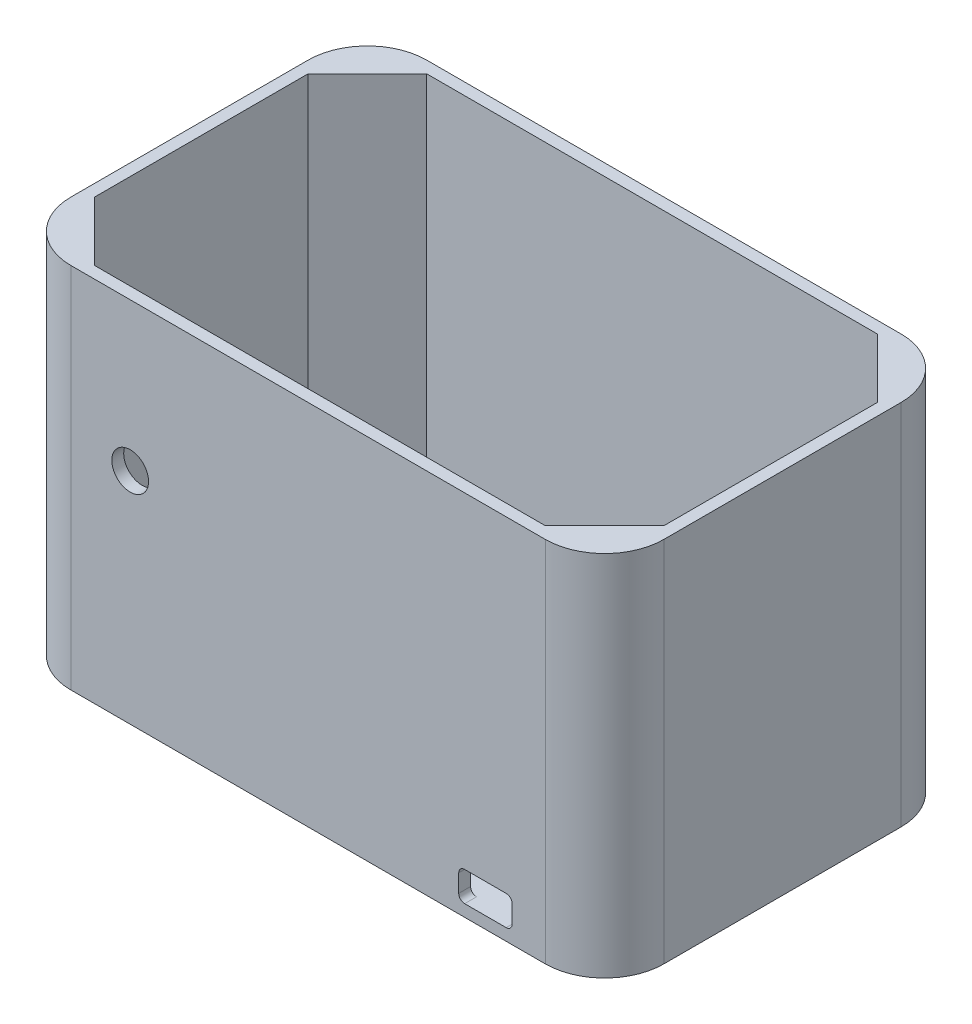
ISO-10303-21;
HEADER;
FILE_DESCRIPTION(('STEP AP214'),'2;1');
FILE_NAME('part.step','',(''),(''),'','','');
FILE_SCHEMA(('AUTOMOTIVE_DESIGN { 1 0 10303 214 1 1 1 1 }'));
ENDSEC;
DATA;
#1=APPLICATION_CONTEXT('core data for automotive mechanical design processes');
#2=APPLICATION_PROTOCOL_DEFINITION('international standard','automotive_design',2000,#1);
#3=PRODUCT_CONTEXT('',#1,'mechanical');
#4=PRODUCT('Part','Part','',(#3));
#5=PRODUCT_RELATED_PRODUCT_CATEGORY('part','',(#4));
#6=PRODUCT_DEFINITION_FORMATION('','',#4);
#7=PRODUCT_DEFINITION_CONTEXT('part definition',#1,'design');
#8=PRODUCT_DEFINITION('design','',#6,#7);
#9=PRODUCT_DEFINITION_SHAPE('','',#8);
#10=(LENGTH_UNIT() NAMED_UNIT(*) SI_UNIT(.MILLI.,.METRE.));
#11=(NAMED_UNIT(*) PLANE_ANGLE_UNIT() SI_UNIT($,.RADIAN.));
#12=(NAMED_UNIT(*) SI_UNIT($,.STERADIAN.) SOLID_ANGLE_UNIT());
#13=UNCERTAINTY_MEASURE_WITH_UNIT(LENGTH_MEASURE(1.E-05),#10,'distance_accuracy_value','');
#14=(GEOMETRIC_REPRESENTATION_CONTEXT(3) GLOBAL_UNCERTAINTY_ASSIGNED_CONTEXT((#13)) GLOBAL_UNIT_ASSIGNED_CONTEXT((#10,
#11,#12)) REPRESENTATION_CONTEXT('',''));
#15=CARTESIAN_POINT('',(0.,0.,0.));
#16=DIRECTION('',(0.,0.,1.));
#17=DIRECTION('',(1.,0.,0.));
#18=AXIS2_PLACEMENT_3D('',#15,#16,#17);
#19=CARTESIAN_POINT('',(90.,2.,-50.));
#20=DIRECTION('',(0.,-1.,0.));
#21=DIRECTION('',(0.,0.,-1.));
#22=AXIS2_PLACEMENT_3D('',#19,#20,#21);
#23=CYLINDRICAL_SURFACE('',#22,9.99999999999999);
#24=CARTESIAN_POINT('',(90.,0.,-50.));
#25=DIRECTION('',(0.,1.,0.));
#26=DIRECTION('',(0.,0.,-1.));
#27=AXIS2_PLACEMENT_3D('',#24,#25,#26);
#28=CIRCLE('',#27,9.99999999999999);
#29=CARTESIAN_POINT('',(100.,0.,-49.9999999999999));
#30=VERTEX_POINT('',#29);
#31=CARTESIAN_POINT('',(89.9999999999999,0.,-60.));
#32=VERTEX_POINT('',#31);
#33=EDGE_CURVE('E393',#30,#32,#28,.T.);
#34=ORIENTED_EDGE('',*,*,#33,.T.);
#35=DIRECTION('',(0.,-1.,0.));
#36=VECTOR('',#35,1.);
#37=CARTESIAN_POINT('',(89.9999999999999,2.,-60.));
#38=LINE('',#37,#36);
#39=CARTESIAN_POINT('',(89.9999999999999,62.,-60.));
#40=VERTEX_POINT('',#39);
#41=EDGE_CURVE('E446',#40,#32,#38,.T.);
#42=ORIENTED_EDGE('',*,*,#41,.F.);
#43=CARTESIAN_POINT('',(90.,62.,-50.));
#44=DIRECTION('',(0.,1.,0.));
#45=DIRECTION('',(0.,0.,1.));
#46=AXIS2_PLACEMENT_3D('',#43,#44,#45);
#47=CIRCLE('',#46,9.99999999999999);
#48=CARTESIAN_POINT('',(100.,62.,-49.9999999999999));
#49=VERTEX_POINT('',#48);
#50=EDGE_CURVE('E277',#49,#40,#47,.T.);
#51=ORIENTED_EDGE('',*,*,#50,.F.);
#52=DIRECTION('',(0.,-1.,0.));
#53=VECTOR('',#52,1.);
#54=CARTESIAN_POINT('',(100.,2.,-49.9999999999999));
#55=LINE('',#54,#53);
#56=EDGE_CURVE('E418',#49,#30,#55,.T.);
#57=ORIENTED_EDGE('',*,*,#56,.T.);
#58=EDGE_LOOP('',(#34,#42,#51,#57));
#59=FACE_BOUND('',#58,.T.);
#60=ADVANCED_FACE('F41',(#59),#23,.T.);
#61=CARTESIAN_POINT('',(10.0000000000001,2.,-60.));
#62=DIRECTION('',(0.,0.,1.));
#63=DIRECTION('',(1.,0.,0.));
#64=AXIS2_PLACEMENT_3D('',#61,#62,#63);
#65=PLANE('',#64);
#66=DIRECTION('',(-1.,0.,0.));
#67=VECTOR('',#66,1.);
#68=CARTESIAN_POINT('',(10.0000000000001,0.,-60.));
#69=LINE('',#68,#67);
#70=CARTESIAN_POINT('',(10.0000000000001,0.,-60.));
#71=VERTEX_POINT('',#70);
#72=EDGE_CURVE('E397',#32,#71,#69,.T.);
#73=ORIENTED_EDGE('',*,*,#72,.T.);
#74=DIRECTION('',(0.,-1.,0.));
#75=VECTOR('',#74,1.);
#76=CARTESIAN_POINT('',(10.0000000000001,2.,-60.));
#77=LINE('',#76,#75);
#78=CARTESIAN_POINT('',(10.0000000000001,62.,-60.));
#79=VERTEX_POINT('',#78);
#80=EDGE_CURVE('E442',#79,#71,#77,.T.);
#81=ORIENTED_EDGE('',*,*,#80,.F.);
#82=DIRECTION('',(-1.,0.,0.));
#83=VECTOR('',#82,1.);
#84=CARTESIAN_POINT('',(0.,62.,-60.));
#85=LINE('',#84,#83);
#86=EDGE_CURVE('E282',#40,#79,#85,.T.);
#87=ORIENTED_EDGE('',*,*,#86,.F.);
#88=ORIENTED_EDGE('',*,*,#41,.T.);
#89=EDGE_LOOP('',(#73,#81,#87,#88));
#90=FACE_BOUND('',#89,.T.);
#91=ADVANCED_FACE('F501',(#90),#65,.F.);
#92=CARTESIAN_POINT('',(10.,2.,-50.));
#93=DIRECTION('',(0.,-1.,0.));
#94=DIRECTION('',(0.,0.,-1.));
#95=AXIS2_PLACEMENT_3D('',#92,#93,#94);
#96=CYLINDRICAL_SURFACE('',#95,10.);
#97=CARTESIAN_POINT('',(10.,0.,-50.));
#98=DIRECTION('',(0.,1.,0.));
#99=DIRECTION('',(0.,0.,-1.));
#100=AXIS2_PLACEMENT_3D('',#97,#98,#99);
#101=CIRCLE('',#100,10.);
#102=CARTESIAN_POINT('',(0.,0.,-49.9999999999999));
#103=VERTEX_POINT('',#102);
#104=EDGE_CURVE('E400',#71,#103,#101,.T.);
#105=ORIENTED_EDGE('',*,*,#104,.T.);
#106=DIRECTION('',(0.,-1.,0.));
#107=VECTOR('',#106,1.);
#108=CARTESIAN_POINT('',(0.,2.,-49.9999999999999));
#109=LINE('',#108,#107);
#110=CARTESIAN_POINT('',(0.,62.,-49.9999999999999));
#111=VERTEX_POINT('',#110);
#112=EDGE_CURVE('E438',#111,#103,#109,.T.);
#113=ORIENTED_EDGE('',*,*,#112,.F.);
#114=CARTESIAN_POINT('',(10.,62.,-50.));
#115=DIRECTION('',(0.,1.,0.));
#116=DIRECTION('',(0.,0.,1.));
#117=AXIS2_PLACEMENT_3D('',#114,#115,#116);
#118=CIRCLE('',#117,10.);
#119=EDGE_CURVE('E286',#79,#111,#118,.T.);
#120=ORIENTED_EDGE('',*,*,#119,.F.);
#121=ORIENTED_EDGE('',*,*,#80,.T.);
#122=EDGE_LOOP('',(#105,#113,#120,#121));
#123=FACE_BOUND('',#122,.T.);
#124=ADVANCED_FACE('F506',(#123),#96,.T.);
#125=CARTESIAN_POINT('',(0.,2.,-10.0000000000001));
#126=DIRECTION('',(1.,0.,0.));
#127=DIRECTION('',(0.,0.,-1.));
#128=AXIS2_PLACEMENT_3D('',#125,#126,#127);
#129=PLANE('',#128);
#130=DIRECTION('',(0.,0.,1.));
#131=VECTOR('',#130,1.);
#132=CARTESIAN_POINT('',(0.,0.,-10.0000000000001));
#133=LINE('',#132,#131);
#134=CARTESIAN_POINT('',(0.,0.,-10.0000000000001));
#135=VERTEX_POINT('',#134);
#136=EDGE_CURVE('E403',#103,#135,#133,.T.);
#137=ORIENTED_EDGE('',*,*,#136,.T.);
#138=DIRECTION('',(0.,-1.,0.));
#139=VECTOR('',#138,1.);
#140=CARTESIAN_POINT('',(0.,2.,-10.0000000000001));
#141=LINE('',#140,#139);
#142=CARTESIAN_POINT('',(0.,62.,-10.0000000000001));
#143=VERTEX_POINT('',#142);
#144=EDGE_CURVE('E434',#143,#135,#141,.T.);
#145=ORIENTED_EDGE('',*,*,#144,.F.);
#146=DIRECTION('',(0.,0.,1.));
#147=VECTOR('',#146,1.);
#148=CARTESIAN_POINT('',(0.,62.,0.));
#149=LINE('',#148,#147);
#150=EDGE_CURVE('E290',#111,#143,#149,.T.);
#151=ORIENTED_EDGE('',*,*,#150,.F.);
#152=ORIENTED_EDGE('',*,*,#112,.T.);
#153=EDGE_LOOP('',(#137,#145,#151,#152));
#154=FACE_BOUND('',#153,.T.);
#155=ADVANCED_FACE('F497',(#154),#129,.F.);
#156=CARTESIAN_POINT('',(10.,2.,-10.));
#157=DIRECTION('',(0.,-1.,0.));
#158=DIRECTION('',(0.,0.,-1.));
#159=AXIS2_PLACEMENT_3D('',#156,#157,#158);
#160=CYLINDRICAL_SURFACE('',#159,10.);
#161=CARTESIAN_POINT('',(10.,0.,-10.));
#162=DIRECTION('',(0.,1.,0.));
#163=DIRECTION('',(0.,0.,-1.));
#164=AXIS2_PLACEMENT_3D('',#161,#162,#163);
#165=CIRCLE('',#164,10.);
#166=CARTESIAN_POINT('',(10.0000000000001,0.,0.));
#167=VERTEX_POINT('',#166);
#168=EDGE_CURVE('E406',#135,#167,#165,.T.);
#169=ORIENTED_EDGE('',*,*,#168,.T.);
#170=DIRECTION('',(0.,-1.,0.));
#171=VECTOR('',#170,1.);
#172=CARTESIAN_POINT('',(10.0000000000001,2.,0.));
#173=LINE('',#172,#171);
#174=CARTESIAN_POINT('',(10.0000000000001,62.,0.));
#175=VERTEX_POINT('',#174);
#176=EDGE_CURVE('E430',#175,#167,#173,.T.);
#177=ORIENTED_EDGE('',*,*,#176,.F.);
#178=CARTESIAN_POINT('',(10.,62.,-10.));
#179=DIRECTION('',(0.,1.,0.));
#180=DIRECTION('',(0.,0.,1.));
#181=AXIS2_PLACEMENT_3D('',#178,#179,#180);
#182=CIRCLE('',#181,10.);
#183=EDGE_CURVE('E294',#143,#175,#182,.T.);
#184=ORIENTED_EDGE('',*,*,#183,.F.);
#185=ORIENTED_EDGE('',*,*,#144,.T.);
#186=EDGE_LOOP('',(#169,#177,#184,#185));
#187=FACE_BOUND('',#186,.T.);
#188=ADVANCED_FACE('F488',(#187),#160,.T.);
#189=CARTESIAN_POINT('',(10.0000000000001,2.,0.));
#190=DIRECTION('',(0.,0.,-1.));
#191=DIRECTION('',(-1.,0.,0.));
#192=AXIS2_PLACEMENT_3D('',#189,#190,#191);
#193=PLANE('',#192);
#194=CARTESIAN_POINT('',(20.0000000000001,37.,0.));
#195=DIRECTION('',(0.,0.,1.));
#196=DIRECTION('',(1.,0.,0.));
#197=AXIS2_PLACEMENT_3D('',#194,#195,#196);
#198=CIRCLE('',#197,3.1);
#199=CARTESIAN_POINT('',(23.1000000000001,37.,0.));
#200=VERTEX_POINT('',#199);
#201=EDGE_CURVE('E250',#200,#200,#198,.T.);
#202=ORIENTED_EDGE('',*,*,#201,.F.);
#203=EDGE_LOOP('',(#202));
#204=FACE_BOUND('',#203,.T.);
#205=DIRECTION('',(-1.,0.,0.));
#206=VECTOR('',#205,1.);
#207=CARTESIAN_POINT('',(76.4,7.,0.));
#208=LINE('',#207,#206);
#209=CARTESIAN_POINT('',(83.4,7.,0.));
#210=VERTEX_POINT('',#209);
#211=CARTESIAN_POINT('',(76.4,7.,0.));
#212=VERTEX_POINT('',#211);
#213=EDGE_CURVE('E215',#210,#212,#208,.T.);
#214=ORIENTED_EDGE('',*,*,#213,.F.);
#215=CARTESIAN_POINT('',(83.4,6.,0.));
#216=DIRECTION('',(0.,0.,1.));
#217=DIRECTION('',(-1.,0.,0.));
#218=AXIS2_PLACEMENT_3D('',#215,#216,#217);
#219=CIRCLE('',#218,1.);
#220=CARTESIAN_POINT('',(84.4,6.,0.));
#221=VERTEX_POINT('',#220);
#222=EDGE_CURVE('E57',#221,#210,#219,.T.);
#223=ORIENTED_EDGE('',*,*,#222,.F.);
#224=DIRECTION('',(0.,1.,0.));
#225=VECTOR('',#224,1.);
#226=CARTESIAN_POINT('',(84.4,3.,0.));
#227=LINE('',#226,#225);
#228=CARTESIAN_POINT('',(84.4,3.,0.));
#229=VERTEX_POINT('',#228);
#230=EDGE_CURVE('E243',#229,#221,#227,.T.);
#231=ORIENTED_EDGE('',*,*,#230,.F.);
#232=CARTESIAN_POINT('',(83.4,3.,0.));
#233=DIRECTION('',(0.,0.,1.));
#234=DIRECTION('',(1.,0.,0.));
#235=AXIS2_PLACEMENT_3D('',#232,#233,#234);
#236=CIRCLE('',#235,1.);
#237=CARTESIAN_POINT('',(83.4,2.,0.));
#238=VERTEX_POINT('',#237);
#239=EDGE_CURVE('E239',#238,#229,#236,.T.);
#240=ORIENTED_EDGE('',*,*,#239,.F.);
#241=DIRECTION('',(1.,0.,0.));
#242=VECTOR('',#241,1.);
#243=CARTESIAN_POINT('',(76.4,2.,0.));
#244=LINE('',#243,#242);
#245=CARTESIAN_POINT('',(76.4,2.,0.));
#246=VERTEX_POINT('',#245);
#247=EDGE_CURVE('E235',#246,#238,#244,.T.);
#248=ORIENTED_EDGE('',*,*,#247,.F.);
#249=CARTESIAN_POINT('',(76.4,3.,0.));
#250=DIRECTION('',(0.,0.,1.));
#251=DIRECTION('',(-1.,0.,0.));
#252=AXIS2_PLACEMENT_3D('',#249,#250,#251);
#253=CIRCLE('',#252,1.);
#254=CARTESIAN_POINT('',(75.4,3.,0.));
#255=VERTEX_POINT('',#254);
#256=EDGE_CURVE('E228',#255,#246,#253,.T.);
#257=ORIENTED_EDGE('',*,*,#256,.F.);
#258=DIRECTION('',(0.,-1.,0.));
#259=VECTOR('',#258,1.);
#260=CARTESIAN_POINT('',(75.4,3.,0.));
#261=LINE('',#260,#259);
#262=CARTESIAN_POINT('',(75.4,6.,0.));
#263=VERTEX_POINT('',#262);
#264=EDGE_CURVE('E224',#263,#255,#261,.T.);
#265=ORIENTED_EDGE('',*,*,#264,.F.);
#266=CARTESIAN_POINT('',(76.4,6.,0.));
#267=DIRECTION('',(0.,0.,1.));
#268=DIRECTION('',(-1.,0.,0.));
#269=AXIS2_PLACEMENT_3D('',#266,#267,#268);
#270=CIRCLE('',#269,1.);
#271=EDGE_CURVE('E205',#212,#263,#270,.T.);
#272=ORIENTED_EDGE('',*,*,#271,.F.);
#273=EDGE_LOOP('',(#214,#223,#231,#240,#248,#257,#265,#272));
#274=FACE_BOUND('',#273,.T.);
#275=DIRECTION('',(1.,0.,0.));
#276=VECTOR('',#275,1.);
#277=CARTESIAN_POINT('',(10.0000000000001,0.,0.));
#278=LINE('',#277,#276);
#279=CARTESIAN_POINT('',(89.9999999999999,0.,0.));
#280=VERTEX_POINT('',#279);
#281=EDGE_CURVE('E409',#167,#280,#278,.T.);
#282=ORIENTED_EDGE('',*,*,#281,.T.);
#283=DIRECTION('',(0.,-1.,0.));
#284=VECTOR('',#283,1.);
#285=CARTESIAN_POINT('',(89.9999999999999,2.,0.));
#286=LINE('',#285,#284);
#287=CARTESIAN_POINT('',(90.,62.,0.));
#288=VERTEX_POINT('',#287);
#289=EDGE_CURVE('E426',#288,#280,#286,.T.);
#290=ORIENTED_EDGE('',*,*,#289,.F.);
#291=DIRECTION('',(1.,0.,0.));
#292=VECTOR('',#291,1.);
#293=CARTESIAN_POINT('',(0.,62.,0.));
#294=LINE('',#293,#292);
#295=EDGE_CURVE('E298',#175,#288,#294,.T.);
#296=ORIENTED_EDGE('',*,*,#295,.F.);
#297=ORIENTED_EDGE('',*,*,#176,.T.);
#298=EDGE_LOOP('',(#282,#290,#296,#297));
#299=FACE_BOUND('',#298,.T.);
#300=ADVANCED_FACE('F220',(#204,#274,#299),#193,.F.);
#301=CARTESIAN_POINT('',(90.,2.,-10.));
#302=DIRECTION('',(0.,-1.,0.));
#303=DIRECTION('',(0.,0.,-1.));
#304=AXIS2_PLACEMENT_3D('',#301,#302,#303);
#305=CYLINDRICAL_SURFACE('',#304,10.);
#306=CARTESIAN_POINT('',(90.,0.,-10.));
#307=DIRECTION('',(0.,1.,0.));
#308=DIRECTION('',(0.,0.,-1.));
#309=AXIS2_PLACEMENT_3D('',#306,#307,#308);
#310=CIRCLE('',#309,10.);
#311=CARTESIAN_POINT('',(100.,0.,-10.0000000000001));
#312=VERTEX_POINT('',#311);
#313=EDGE_CURVE('E412',#280,#312,#310,.T.);
#314=ORIENTED_EDGE('',*,*,#313,.T.);
#315=DIRECTION('',(0.,-1.,0.));
#316=VECTOR('',#315,1.);
#317=CARTESIAN_POINT('',(100.,2.,-10.0000000000001));
#318=LINE('',#317,#316);
#319=CARTESIAN_POINT('',(100.,62.,-10.0000000000001));
#320=VERTEX_POINT('',#319);
#321=EDGE_CURVE('E422',#320,#312,#318,.T.);
#322=ORIENTED_EDGE('',*,*,#321,.F.);
#323=CARTESIAN_POINT('',(90.,62.,-10.));
#324=DIRECTION('',(0.,1.,0.));
#325=DIRECTION('',(0.,0.,1.));
#326=AXIS2_PLACEMENT_3D('',#323,#324,#325);
#327=CIRCLE('',#326,10.);
#328=EDGE_CURVE('E302',#288,#320,#327,.T.);
#329=ORIENTED_EDGE('',*,*,#328,.F.);
#330=ORIENTED_EDGE('',*,*,#289,.T.);
#331=EDGE_LOOP('',(#314,#322,#329,#330));
#332=FACE_BOUND('',#331,.T.);
#333=ADVANCED_FACE('F487',(#332),#305,.T.);
#334=CARTESIAN_POINT('',(100.,2.,-10.0000000000001));
#335=DIRECTION('',(-1.,0.,0.));
#336=DIRECTION('',(0.,0.,1.));
#337=AXIS2_PLACEMENT_3D('',#334,#335,#336);
#338=PLANE('',#337);
#339=DIRECTION('',(0.,0.,-1.));
#340=VECTOR('',#339,1.);
#341=CARTESIAN_POINT('',(100.,0.,-10.0000000000001));
#342=LINE('',#341,#340);
#343=EDGE_CURVE('E415',#312,#30,#342,.T.);
#344=ORIENTED_EDGE('',*,*,#343,.T.);
#345=ORIENTED_EDGE('',*,*,#56,.F.);
#346=DIRECTION('',(0.,0.,-1.));
#347=VECTOR('',#346,1.);
#348=CARTESIAN_POINT('',(100.,62.,0.));
#349=LINE('',#348,#347);
#350=EDGE_CURVE('E273',#320,#49,#349,.T.);
#351=ORIENTED_EDGE('',*,*,#350,.F.);
#352=ORIENTED_EDGE('',*,*,#321,.T.);
#353=EDGE_LOOP('',(#344,#345,#351,#352));
#354=FACE_BOUND('',#353,.T.);
#355=ADVANCED_FACE('F494',(#354),#338,.F.);
#356=CARTESIAN_POINT('',(90.,0.,-50.));
#357=DIRECTION('',(0.,-1.,0.));
#358=DIRECTION('',(0.,0.,-1.));
#359=AXIS2_PLACEMENT_3D('',#356,#357,#358);
#360=PLANE('',#359);
#361=ORIENTED_EDGE('',*,*,#33,.F.);
#362=ORIENTED_EDGE('',*,*,#343,.F.);
#363=ORIENTED_EDGE('',*,*,#313,.F.);
#364=ORIENTED_EDGE('',*,*,#281,.F.);
#365=ORIENTED_EDGE('',*,*,#168,.F.);
#366=ORIENTED_EDGE('',*,*,#136,.F.);
#367=ORIENTED_EDGE('',*,*,#104,.F.);
#368=ORIENTED_EDGE('',*,*,#72,.F.);
#369=EDGE_LOOP('',(#361,#362,#363,#364,#365,#366,#367,#368));
#370=FACE_BOUND('',#369,.T.);
#371=ADVANCED_FACE('F512',(#370),#360,.T.);
#372=CARTESIAN_POINT('',(0.,62.,-1.99999999999998));
#373=DIRECTION('',(0.,0.,-1.));
#374=DIRECTION('',(-1.,0.,0.));
#375=AXIS2_PLACEMENT_3D('',#372,#373,#374);
#376=PLANE('',#375);
#377=CARTESIAN_POINT('',(20.0000000000001,37.,-1.99999999999998));
#378=DIRECTION('',(0.,0.,-1.));
#379=DIRECTION('',(-1.,0.,0.));
#380=AXIS2_PLACEMENT_3D('',#377,#378,#379);
#381=CIRCLE('',#380,3.1);
#382=CARTESIAN_POINT('',(16.9000000000001,37.,-1.99999999999998));
#383=VERTEX_POINT('',#382);
#384=EDGE_CURVE('E44',#383,#383,#381,.T.);
#385=ORIENTED_EDGE('',*,*,#384,.F.);
#386=EDGE_LOOP('',(#385));
#387=FACE_BOUND('',#386,.T.);
#388=CARTESIAN_POINT('',(83.4,3.,-1.99999999999999));
#389=DIRECTION('',(0.,0.,-1.));
#390=DIRECTION('',(-1.,0.,0.));
#391=AXIS2_PLACEMENT_3D('',#388,#389,#390);
#392=CIRCLE('',#391,1.);
#393=CARTESIAN_POINT('',(84.4,3.,-1.99999999999999));
#394=VERTEX_POINT('',#393);
#395=CARTESIAN_POINT('',(83.4,2.,-1.99999999999999));
#396=VERTEX_POINT('',#395);
#397=EDGE_CURVE('E270',#394,#396,#392,.T.);
#398=ORIENTED_EDGE('',*,*,#397,.F.);
#399=DIRECTION('',(0.,-1.,0.));
#400=VECTOR('',#399,1.);
#401=CARTESIAN_POINT('',(84.4,62.,-1.99999999999999));
#402=LINE('',#401,#400);
#403=CARTESIAN_POINT('',(84.4,6.,-1.99999999999999));
#404=VERTEX_POINT('',#403);
#405=EDGE_CURVE('E11',#404,#394,#402,.T.);
#406=ORIENTED_EDGE('',*,*,#405,.F.);
#407=CARTESIAN_POINT('',(83.4,6.,-1.99999999999999));
#408=DIRECTION('',(0.,0.,-1.));
#409=DIRECTION('',(-1.,0.,0.));
#410=AXIS2_PLACEMENT_3D('',#407,#408,#409);
#411=CIRCLE('',#410,1.);
#412=CARTESIAN_POINT('',(83.4,7.,-1.99999999999999));
#413=VERTEX_POINT('',#412);
#414=EDGE_CURVE('E50',#413,#404,#411,.T.);
#415=ORIENTED_EDGE('',*,*,#414,.F.);
#416=DIRECTION('',(1.,0.,0.));
#417=VECTOR('',#416,1.);
#418=CARTESIAN_POINT('',(0.,6.99999999999999,-1.99999999999998));
#419=LINE('',#418,#417);
#420=CARTESIAN_POINT('',(76.4,7.,-1.99999999999999));
#421=VERTEX_POINT('',#420);
#422=EDGE_CURVE('E450',#421,#413,#419,.T.);
#423=ORIENTED_EDGE('',*,*,#422,.F.);
#424=CARTESIAN_POINT('',(76.4,6.,-1.99999999999999));
#425=DIRECTION('',(0.,0.,-1.));
#426=DIRECTION('',(-1.,0.,0.));
#427=AXIS2_PLACEMENT_3D('',#424,#425,#426);
#428=CIRCLE('',#427,1.);
#429=CARTESIAN_POINT('',(75.4,6.,-1.99999999999999));
#430=VERTEX_POINT('',#429);
#431=EDGE_CURVE('E208',#430,#421,#428,.T.);
#432=ORIENTED_EDGE('',*,*,#431,.F.);
#433=DIRECTION('',(0.,1.,0.));
#434=VECTOR('',#433,1.);
#435=CARTESIAN_POINT('',(75.4,62.,-1.99999999999999));
#436=LINE('',#435,#434);
#437=CARTESIAN_POINT('',(75.4,3.,-1.99999999999999));
#438=VERTEX_POINT('',#437);
#439=EDGE_CURVE('E455',#438,#430,#436,.T.);
#440=ORIENTED_EDGE('',*,*,#439,.F.);
#441=CARTESIAN_POINT('',(76.4,3.,-1.99999999999999));
#442=DIRECTION('',(0.,0.,-1.));
#443=DIRECTION('',(-1.,0.,0.));
#444=AXIS2_PLACEMENT_3D('',#441,#442,#443);
#445=CIRCLE('',#444,1.);
#446=CARTESIAN_POINT('',(76.4,2.,-1.99999999999999));
#447=VERTEX_POINT('',#446);
#448=EDGE_CURVE('E267',#447,#438,#445,.T.);
#449=ORIENTED_EDGE('',*,*,#448,.F.);
#450=DIRECTION('',(1.,0.,0.));
#451=VECTOR('',#450,1.);
#452=CARTESIAN_POINT('',(0.,2.,-1.99999999999998));
#453=LINE('',#452,#451);
#454=CARTESIAN_POINT('',(12.,2.,-1.99999999999998));
#455=VERTEX_POINT('',#454);
#456=EDGE_CURVE('E337',#455,#447,#453,.T.);
#457=ORIENTED_EDGE('',*,*,#456,.F.);
#458=DIRECTION('',(0.,-1.,0.));
#459=VECTOR('',#458,1.);
#460=CARTESIAN_POINT('',(12.,62.,-1.99999999999998));
#461=LINE('',#460,#459);
#462=CARTESIAN_POINT('',(12.,62.,-1.99999999999998));
#463=VERTEX_POINT('',#462);
#464=EDGE_CURVE('E390',#463,#455,#461,.T.);
#465=ORIENTED_EDGE('',*,*,#464,.F.);
#466=DIRECTION('',(1.,0.,0.));
#467=VECTOR('',#466,1.);
#468=CARTESIAN_POINT('',(0.,62.,-1.99999999999998));
#469=LINE('',#468,#467);
#470=CARTESIAN_POINT('',(88.,62.,-1.99999999999999));
#471=VERTEX_POINT('',#470);
#472=EDGE_CURVE('E306',#463,#471,#469,.T.);
#473=ORIENTED_EDGE('',*,*,#472,.T.);
#474=DIRECTION('',(0.,-1.,0.));
#475=VECTOR('',#474,1.);
#476=CARTESIAN_POINT('',(88.,62.,-1.99999999999999));
#477=LINE('',#476,#475);
#478=CARTESIAN_POINT('',(88.,2.,-1.99999999999999));
#479=VERTEX_POINT('',#478);
#480=EDGE_CURVE('E336',#471,#479,#477,.T.);
#481=ORIENTED_EDGE('',*,*,#480,.T.);
#482=EDGE_CURVE('E342',#396,#479,#453,.T.);
#483=ORIENTED_EDGE('',*,*,#482,.F.);
#484=EDGE_LOOP('',(#398,#406,#415,#423,#432,#440,#449,#457,#465,#473,#481,#483));
#485=FACE_BOUND('',#484,.T.);
#486=ADVANCED_FACE('F469',(#387,#485),#376,.T.);
#487=CARTESIAN_POINT('',(6.99999999999999,62.,-7.));
#488=DIRECTION('',(-0.707106781186547,0.,0.707106781186548));
#489=DIRECTION('',(0.707106781186548,0.,0.707106781186547));
#490=AXIS2_PLACEMENT_3D('',#487,#488,#489);
#491=PLANE('',#490);
#492=DIRECTION('',(-0.707106781186548,0.,-0.707106781186547));
#493=VECTOR('',#492,1.);
#494=CARTESIAN_POINT('',(6.99999999999999,2.,-7.));
#495=LINE('',#494,#493);
#496=CARTESIAN_POINT('',(2.00000000000002,2.,-12.));
#497=VERTEX_POINT('',#496);
#498=EDGE_CURVE('E341',#455,#497,#495,.T.);
#499=ORIENTED_EDGE('',*,*,#498,.T.);
#500=DIRECTION('',(0.,-1.,0.));
#501=VECTOR('',#500,1.);
#502=CARTESIAN_POINT('',(2.00000000000002,62.,-12.));
#503=LINE('',#502,#501);
#504=CARTESIAN_POINT('',(2.00000000000002,62.,-12.));
#505=VERTEX_POINT('',#504);
#506=EDGE_CURVE('E387',#505,#497,#503,.T.);
#507=ORIENTED_EDGE('',*,*,#506,.F.);
#508=DIRECTION('',(-0.707106781186548,0.,-0.707106781186547));
#509=VECTOR('',#508,1.);
#510=CARTESIAN_POINT('',(6.99999999999999,62.,-7.));
#511=LINE('',#510,#509);
#512=EDGE_CURVE('E310',#463,#505,#511,.T.);
#513=ORIENTED_EDGE('',*,*,#512,.F.);
#514=ORIENTED_EDGE('',*,*,#464,.T.);
#515=EDGE_LOOP('',(#499,#507,#513,#514));
#516=FACE_BOUND('',#515,.T.);
#517=ADVANCED_FACE('F542',(#516),#491,.F.);
#518=CARTESIAN_POINT('',(2.00000000000002,62.,0.));
#519=DIRECTION('',(1.,0.,0.));
#520=DIRECTION('',(0.,0.,-1.));
#521=AXIS2_PLACEMENT_3D('',#518,#519,#520);
#522=PLANE('',#521);
#523=DIRECTION('',(0.,0.,1.));
#524=VECTOR('',#523,1.);
#525=CARTESIAN_POINT('',(2.00000000000002,2.,0.));
#526=LINE('',#525,#524);
#527=CARTESIAN_POINT('',(2.,2.,-48.));
#528=VERTEX_POINT('',#527);
#529=EDGE_CURVE('E346',#528,#497,#526,.T.);
#530=ORIENTED_EDGE('',*,*,#529,.F.);
#531=DIRECTION('',(0.,-1.,0.));
#532=VECTOR('',#531,1.);
#533=CARTESIAN_POINT('',(2.,62.,-48.));
#534=LINE('',#533,#532);
#535=CARTESIAN_POINT('',(2.,62.,-48.));
#536=VERTEX_POINT('',#535);
#537=EDGE_CURVE('E384',#536,#528,#534,.T.);
#538=ORIENTED_EDGE('',*,*,#537,.F.);
#539=DIRECTION('',(0.,0.,1.));
#540=VECTOR('',#539,1.);
#541=CARTESIAN_POINT('',(2.00000000000002,62.,0.));
#542=LINE('',#541,#540);
#543=EDGE_CURVE('E313',#536,#505,#542,.T.);
#544=ORIENTED_EDGE('',*,*,#543,.T.);
#545=ORIENTED_EDGE('',*,*,#506,.T.);
#546=EDGE_LOOP('',(#530,#538,#544,#545));
#547=FACE_BOUND('',#546,.T.);
#548=ADVANCED_FACE('F546',(#547),#522,.T.);
#549=CARTESIAN_POINT('',(-23.,62.,-23.));
#550=DIRECTION('',(0.707106781186548,0.,0.707106781186547));
#551=DIRECTION('',(0.707106781186547,0.,-0.707106781186548));
#552=AXIS2_PLACEMENT_3D('',#549,#550,#551);
#553=PLANE('',#552);
#554=DIRECTION('',(-0.707106781186547,0.,0.707106781186548));
#555=VECTOR('',#554,1.);
#556=CARTESIAN_POINT('',(-23.,2.,-23.));
#557=LINE('',#556,#555);
#558=CARTESIAN_POINT('',(12.,2.,-58.));
#559=VERTEX_POINT('',#558);
#560=EDGE_CURVE('E350',#559,#528,#557,.T.);
#561=ORIENTED_EDGE('',*,*,#560,.F.);
#562=DIRECTION('',(0.,-1.,0.));
#563=VECTOR('',#562,1.);
#564=CARTESIAN_POINT('',(12.,62.,-58.));
#565=LINE('',#564,#563);
#566=CARTESIAN_POINT('',(12.,62.,-58.));
#567=VERTEX_POINT('',#566);
#568=EDGE_CURVE('E381',#567,#559,#565,.T.);
#569=ORIENTED_EDGE('',*,*,#568,.F.);
#570=DIRECTION('',(-0.707106781186547,0.,0.707106781186548));
#571=VECTOR('',#570,1.);
#572=CARTESIAN_POINT('',(-23.,62.,-23.));
#573=LINE('',#572,#571);
#574=EDGE_CURVE('E317',#567,#536,#573,.T.);
#575=ORIENTED_EDGE('',*,*,#574,.T.);
#576=ORIENTED_EDGE('',*,*,#537,.T.);
#577=EDGE_LOOP('',(#561,#569,#575,#576));
#578=FACE_BOUND('',#577,.T.);
#579=ADVANCED_FACE('F550',(#578),#553,.T.);
#580=CARTESIAN_POINT('',(0.,62.,-58.));
#581=DIRECTION('',(0.,0.,-1.));
#582=DIRECTION('',(-1.,0.,0.));
#583=AXIS2_PLACEMENT_3D('',#580,#581,#582);
#584=PLANE('',#583);
#585=DIRECTION('',(1.,0.,0.));
#586=VECTOR('',#585,1.);
#587=CARTESIAN_POINT('',(0.,2.,-58.));
#588=LINE('',#587,#586);
#589=CARTESIAN_POINT('',(88.,2.,-58.));
#590=VERTEX_POINT('',#589);
#591=EDGE_CURVE('E354',#559,#590,#588,.T.);
#592=ORIENTED_EDGE('',*,*,#591,.T.);
#593=DIRECTION('',(0.,-1.,0.));
#594=VECTOR('',#593,1.);
#595=CARTESIAN_POINT('',(88.,62.,-58.));
#596=LINE('',#595,#594);
#597=CARTESIAN_POINT('',(88.,62.,-58.));
#598=VERTEX_POINT('',#597);
#599=EDGE_CURVE('E378',#598,#590,#596,.T.);
#600=ORIENTED_EDGE('',*,*,#599,.F.);
#601=DIRECTION('',(1.,0.,0.));
#602=VECTOR('',#601,1.);
#603=CARTESIAN_POINT('',(0.,62.,-58.));
#604=LINE('',#603,#602);
#605=EDGE_CURVE('E321',#567,#598,#604,.T.);
#606=ORIENTED_EDGE('',*,*,#605,.F.);
#607=ORIENTED_EDGE('',*,*,#568,.T.);
#608=EDGE_LOOP('',(#592,#600,#606,#607));
#609=FACE_BOUND('',#608,.T.);
#610=ADVANCED_FACE('F554',(#609),#584,.F.);
#611=CARTESIAN_POINT('',(73.,62.,-73.));
#612=DIRECTION('',(0.707106781186547,0.,-0.707106781186548));
#613=DIRECTION('',(-0.707106781186548,0.,-0.707106781186547));
#614=AXIS2_PLACEMENT_3D('',#611,#612,#613);
#615=PLANE('',#614);
#616=DIRECTION('',(0.707106781186548,0.,0.707106781186547));
#617=VECTOR('',#616,1.);
#618=CARTESIAN_POINT('',(73.,2.,-73.));
#619=LINE('',#618,#617);
#620=CARTESIAN_POINT('',(98.,2.,-48.));
#621=VERTEX_POINT('',#620);
#622=EDGE_CURVE('E358',#590,#621,#619,.T.);
#623=ORIENTED_EDGE('',*,*,#622,.T.);
#624=DIRECTION('',(0.,-1.,0.));
#625=VECTOR('',#624,1.);
#626=CARTESIAN_POINT('',(98.,62.,-48.));
#627=LINE('',#626,#625);
#628=CARTESIAN_POINT('',(98.,62.,-48.));
#629=VERTEX_POINT('',#628);
#630=EDGE_CURVE('E375',#629,#621,#627,.T.);
#631=ORIENTED_EDGE('',*,*,#630,.F.);
#632=DIRECTION('',(0.707106781186548,0.,0.707106781186547));
#633=VECTOR('',#632,1.);
#634=CARTESIAN_POINT('',(73.,62.,-73.));
#635=LINE('',#634,#633);
#636=EDGE_CURVE('E325',#598,#629,#635,.T.);
#637=ORIENTED_EDGE('',*,*,#636,.F.);
#638=ORIENTED_EDGE('',*,*,#599,.T.);
#639=EDGE_LOOP('',(#623,#631,#637,#638));
#640=FACE_BOUND('',#639,.T.);
#641=ADVANCED_FACE('F558',(#640),#615,.F.);
#642=CARTESIAN_POINT('',(98.,62.,0.));
#643=DIRECTION('',(1.,0.,0.));
#644=DIRECTION('',(0.,0.,-1.));
#645=AXIS2_PLACEMENT_3D('',#642,#643,#644);
#646=PLANE('',#645);
#647=DIRECTION('',(0.,0.,1.));
#648=VECTOR('',#647,1.);
#649=CARTESIAN_POINT('',(98.,2.,0.));
#650=LINE('',#649,#648);
#651=CARTESIAN_POINT('',(98.,2.,-12.));
#652=VERTEX_POINT('',#651);
#653=EDGE_CURVE('E362',#621,#652,#650,.T.);
#654=ORIENTED_EDGE('',*,*,#653,.T.);
#655=DIRECTION('',(0.,-1.,0.));
#656=VECTOR('',#655,1.);
#657=CARTESIAN_POINT('',(98.,62.,-12.));
#658=LINE('',#657,#656);
#659=CARTESIAN_POINT('',(98.,62.,-12.));
#660=VERTEX_POINT('',#659);
#661=EDGE_CURVE('E371',#660,#652,#658,.T.);
#662=ORIENTED_EDGE('',*,*,#661,.F.);
#663=DIRECTION('',(0.,0.,1.));
#664=VECTOR('',#663,1.);
#665=CARTESIAN_POINT('',(98.,62.,0.));
#666=LINE('',#665,#664);
#667=EDGE_CURVE('E329',#629,#660,#666,.T.);
#668=ORIENTED_EDGE('',*,*,#667,.F.);
#669=ORIENTED_EDGE('',*,*,#630,.T.);
#670=EDGE_LOOP('',(#654,#662,#668,#669));
#671=FACE_BOUND('',#670,.T.);
#672=ADVANCED_FACE('F562',(#671),#646,.F.);
#673=CARTESIAN_POINT('',(43.,62.,43.));
#674=DIRECTION('',(-0.707106781186547,0.,-0.707106781186548));
#675=DIRECTION('',(-0.707106781186548,0.,0.707106781186547));
#676=AXIS2_PLACEMENT_3D('',#673,#674,#675);
#677=PLANE('',#676);
#678=DIRECTION('',(0.707106781186548,0.,-0.707106781186547));
#679=VECTOR('',#678,1.);
#680=CARTESIAN_POINT('',(43.,2.,43.));
#681=LINE('',#680,#679);
#682=EDGE_CURVE('E278',#479,#652,#681,.T.);
#683=ORIENTED_EDGE('',*,*,#682,.F.);
#684=ORIENTED_EDGE('',*,*,#480,.F.);
#685=DIRECTION('',(0.707106781186548,0.,-0.707106781186547));
#686=VECTOR('',#685,1.);
#687=CARTESIAN_POINT('',(43.,62.,43.));
#688=LINE('',#687,#686);
#689=EDGE_CURVE('E332',#471,#660,#688,.T.);
#690=ORIENTED_EDGE('',*,*,#689,.T.);
#691=ORIENTED_EDGE('',*,*,#661,.T.);
#692=EDGE_LOOP('',(#683,#684,#690,#691));
#693=FACE_BOUND('',#692,.T.);
#694=ADVANCED_FACE('F566',(#693),#677,.T.);
#695=CARTESIAN_POINT('',(0.,62.,0.));
#696=DIRECTION('',(0.,1.,0.));
#697=DIRECTION('',(0.,0.,1.));
#698=AXIS2_PLACEMENT_3D('',#695,#696,#697);
#699=PLANE('',#698);
#700=ORIENTED_EDGE('',*,*,#350,.T.);
#701=ORIENTED_EDGE('',*,*,#50,.T.);
#702=ORIENTED_EDGE('',*,*,#86,.T.);
#703=ORIENTED_EDGE('',*,*,#119,.T.);
#704=ORIENTED_EDGE('',*,*,#150,.T.);
#705=ORIENTED_EDGE('',*,*,#183,.T.);
#706=ORIENTED_EDGE('',*,*,#295,.T.);
#707=ORIENTED_EDGE('',*,*,#328,.T.);
#708=EDGE_LOOP('',(#700,#701,#702,#703,#704,#705,#706,#707));
#709=FACE_BOUND('',#708,.T.);
#710=ORIENTED_EDGE('',*,*,#472,.F.);
#711=ORIENTED_EDGE('',*,*,#512,.T.);
#712=ORIENTED_EDGE('',*,*,#543,.F.);
#713=ORIENTED_EDGE('',*,*,#574,.F.);
#714=ORIENTED_EDGE('',*,*,#605,.T.);
#715=ORIENTED_EDGE('',*,*,#636,.T.);
#716=ORIENTED_EDGE('',*,*,#667,.T.);
#717=ORIENTED_EDGE('',*,*,#689,.F.);
#718=EDGE_LOOP('',(#710,#711,#712,#713,#714,#715,#716,#717));
#719=FACE_BOUND('',#718,.T.);
#720=ADVANCED_FACE('F519',(#709,#719),#699,.T.);
#721=CARTESIAN_POINT('',(90.,2.,-50.));
#722=DIRECTION('',(0.,-1.,0.));
#723=DIRECTION('',(0.,0.,-1.));
#724=AXIS2_PLACEMENT_3D('',#721,#722,#723);
#725=PLANE('',#724);
#726=ORIENTED_EDGE('',*,*,#456,.T.);
#727=DIRECTION('',(0.,0.,1.));
#728=VECTOR('',#727,1.);
#729=CARTESIAN_POINT('',(76.4,2.,-10.));
#730=LINE('',#729,#728);
#731=EDGE_CURVE('E257',#447,#246,#730,.T.);
#732=ORIENTED_EDGE('',*,*,#731,.T.);
#733=ORIENTED_EDGE('',*,*,#247,.T.);
#734=DIRECTION('',(0.,0.,1.));
#735=VECTOR('',#734,1.);
#736=CARTESIAN_POINT('',(83.4,2.,-10.));
#737=LINE('',#736,#735);
#738=EDGE_CURVE('E254',#396,#238,#737,.T.);
#739=ORIENTED_EDGE('',*,*,#738,.F.);
#740=ORIENTED_EDGE('',*,*,#482,.T.);
#741=ORIENTED_EDGE('',*,*,#682,.T.);
#742=ORIENTED_EDGE('',*,*,#653,.F.);
#743=ORIENTED_EDGE('',*,*,#622,.F.);
#744=ORIENTED_EDGE('',*,*,#591,.F.);
#745=ORIENTED_EDGE('',*,*,#560,.T.);
#746=ORIENTED_EDGE('',*,*,#529,.T.);
#747=ORIENTED_EDGE('',*,*,#498,.F.);
#748=EDGE_LOOP('',(#726,#732,#733,#739,#740,#741,#742,#743,#744,#745,#746,#747));
#749=FACE_BOUND('',#748,.T.);
#750=ADVANCED_FACE('F475',(#749),#725,.F.);
#751=CARTESIAN_POINT('',(83.4,6.,-10.));
#752=DIRECTION('',(0.,0.,1.));
#753=DIRECTION('',(1.,0.,0.));
#754=AXIS2_PLACEMENT_3D('',#751,#752,#753);
#755=CYLINDRICAL_SURFACE('',#754,1.);
#756=ORIENTED_EDGE('',*,*,#414,.T.);
#757=DIRECTION('',(0.,0.,1.));
#758=VECTOR('',#757,1.);
#759=CARTESIAN_POINT('',(84.4,6.,-10.));
#760=LINE('',#759,#758);
#761=EDGE_CURVE('E247',#404,#221,#760,.T.);
#762=ORIENTED_EDGE('',*,*,#761,.T.);
#763=ORIENTED_EDGE('',*,*,#222,.T.);
#764=DIRECTION('',(0.,0.,1.));
#765=VECTOR('',#764,1.);
#766=CARTESIAN_POINT('',(83.4,7.,-10.));
#767=LINE('',#766,#765);
#768=EDGE_CURVE('E212',#413,#210,#767,.T.);
#769=ORIENTED_EDGE('',*,*,#768,.F.);
#770=EDGE_LOOP('',(#756,#762,#763,#769));
#771=FACE_BOUND('',#770,.T.);
#772=ADVANCED_FACE('F461',(#771),#755,.F.);
#773=CARTESIAN_POINT('',(84.4,3.,-10.));
#774=DIRECTION('',(1.,0.,0.));
#775=DIRECTION('',(0.,0.,-1.));
#776=AXIS2_PLACEMENT_3D('',#773,#774,#775);
#777=PLANE('',#776);
#778=ORIENTED_EDGE('',*,*,#405,.T.);
#779=DIRECTION('',(0.,0.,1.));
#780=VECTOR('',#779,1.);
#781=CARTESIAN_POINT('',(84.4,3.,-10.));
#782=LINE('',#781,#780);
#783=EDGE_CURVE('E251',#394,#229,#782,.T.);
#784=ORIENTED_EDGE('',*,*,#783,.T.);
#785=ORIENTED_EDGE('',*,*,#230,.T.);
#786=ORIENTED_EDGE('',*,*,#761,.F.);
#787=EDGE_LOOP('',(#778,#784,#785,#786));
#788=FACE_BOUND('',#787,.T.);
#789=ADVANCED_FACE('F465',(#788),#777,.F.);
#790=CARTESIAN_POINT('',(83.4,3.,-10.));
#791=DIRECTION('',(0.,0.,1.));
#792=DIRECTION('',(1.,0.,0.));
#793=AXIS2_PLACEMENT_3D('',#790,#791,#792);
#794=CYLINDRICAL_SURFACE('',#793,1.);
#795=ORIENTED_EDGE('',*,*,#397,.T.);
#796=ORIENTED_EDGE('',*,*,#738,.T.);
#797=ORIENTED_EDGE('',*,*,#239,.T.);
#798=ORIENTED_EDGE('',*,*,#783,.F.);
#799=EDGE_LOOP('',(#795,#796,#797,#798));
#800=FACE_BOUND('',#799,.T.);
#801=ADVANCED_FACE('F473',(#800),#794,.F.);
#802=CARTESIAN_POINT('',(76.4,3.,-10.));
#803=DIRECTION('',(0.,0.,1.));
#804=DIRECTION('',(1.,0.,0.));
#805=AXIS2_PLACEMENT_3D('',#802,#803,#804);
#806=CYLINDRICAL_SURFACE('',#805,1.);
#807=ORIENTED_EDGE('',*,*,#448,.T.);
#808=DIRECTION('',(0.,0.,1.));
#809=VECTOR('',#808,1.);
#810=CARTESIAN_POINT('',(75.4,3.,-10.));
#811=LINE('',#810,#809);
#812=EDGE_CURVE('E260',#438,#255,#811,.T.);
#813=ORIENTED_EDGE('',*,*,#812,.T.);
#814=ORIENTED_EDGE('',*,*,#256,.T.);
#815=ORIENTED_EDGE('',*,*,#731,.F.);
#816=EDGE_LOOP('',(#807,#813,#814,#815));
#817=FACE_BOUND('',#816,.T.);
#818=ADVANCED_FACE('F582',(#817),#806,.F.);
#819=CARTESIAN_POINT('',(75.4,3.,-10.));
#820=DIRECTION('',(-1.,0.,0.));
#821=DIRECTION('',(0.,0.,1.));
#822=AXIS2_PLACEMENT_3D('',#819,#820,#821);
#823=PLANE('',#822);
#824=ORIENTED_EDGE('',*,*,#439,.T.);
#825=DIRECTION('',(0.,0.,1.));
#826=VECTOR('',#825,1.);
#827=CARTESIAN_POINT('',(75.4,6.,-10.));
#828=LINE('',#827,#826);
#829=EDGE_CURVE('E211',#430,#263,#828,.T.);
#830=ORIENTED_EDGE('',*,*,#829,.T.);
#831=ORIENTED_EDGE('',*,*,#264,.T.);
#832=ORIENTED_EDGE('',*,*,#812,.F.);
#833=EDGE_LOOP('',(#824,#830,#831,#832));
#834=FACE_BOUND('',#833,.T.);
#835=ADVANCED_FACE('F579',(#834),#823,.F.);
#836=CARTESIAN_POINT('',(76.4,6.,-10.));
#837=DIRECTION('',(0.,0.,1.));
#838=DIRECTION('',(1.,0.,0.));
#839=AXIS2_PLACEMENT_3D('',#836,#837,#838);
#840=CYLINDRICAL_SURFACE('',#839,1.);
#841=ORIENTED_EDGE('',*,*,#431,.T.);
#842=DIRECTION('',(0.,0.,1.));
#843=VECTOR('',#842,1.);
#844=CARTESIAN_POINT('',(76.4,7.,-10.));
#845=LINE('',#844,#843);
#846=EDGE_CURVE('E65',#421,#212,#845,.T.);
#847=ORIENTED_EDGE('',*,*,#846,.T.);
#848=ORIENTED_EDGE('',*,*,#271,.T.);
#849=ORIENTED_EDGE('',*,*,#829,.F.);
#850=EDGE_LOOP('',(#841,#847,#848,#849));
#851=FACE_BOUND('',#850,.T.);
#852=ADVANCED_FACE('F202',(#851),#840,.F.);
#853=CARTESIAN_POINT('',(76.4,7.,-10.));
#854=DIRECTION('',(0.,1.,0.));
#855=DIRECTION('',(-1.,0.,0.));
#856=AXIS2_PLACEMENT_3D('',#853,#854,#855);
#857=PLANE('',#856);
#858=ORIENTED_EDGE('',*,*,#422,.T.);
#859=ORIENTED_EDGE('',*,*,#768,.T.);
#860=ORIENTED_EDGE('',*,*,#213,.T.);
#861=ORIENTED_EDGE('',*,*,#846,.F.);
#862=EDGE_LOOP('',(#858,#859,#860,#861));
#863=FACE_BOUND('',#862,.T.);
#864=ADVANCED_FACE('F216',(#863),#857,.F.);
#865=CARTESIAN_POINT('',(20.0000000000001,37.,-10.));
#866=DIRECTION('',(0.,0.,1.));
#867=DIRECTION('',(1.,0.,0.));
#868=AXIS2_PLACEMENT_3D('',#865,#866,#867);
#869=CYLINDRICAL_SURFACE('',#868,3.1);
#870=ORIENTED_EDGE('',*,*,#384,.T.);
#871=EDGE_LOOP('',(#870));
#872=FACE_BOUND('',#871,.T.);
#873=ORIENTED_EDGE('',*,*,#201,.T.);
#874=EDGE_LOOP('',(#873));
#875=FACE_BOUND('',#874,.T.);
#876=ADVANCED_FACE('F484',(#872,#875),#869,.F.);
#877=CLOSED_SHELL('',(#60,#91,#124,#155,#188,#300,#333,#355,#371,#486,#517,#548,#579,#610,#641,
#672,#694,#720,#750,#772,#789,#801,#818,#835,#852,#864,#876));
#878=MANIFOLD_SOLID_BREP('B2',#877);
#879=ADVANCED_BREP_SHAPE_REPRESENTATION('',(#18,#878),#14);
#880=SHAPE_DEFINITION_REPRESENTATION(#9,#879);
ENDSEC;
END-ISO-10303-21;
